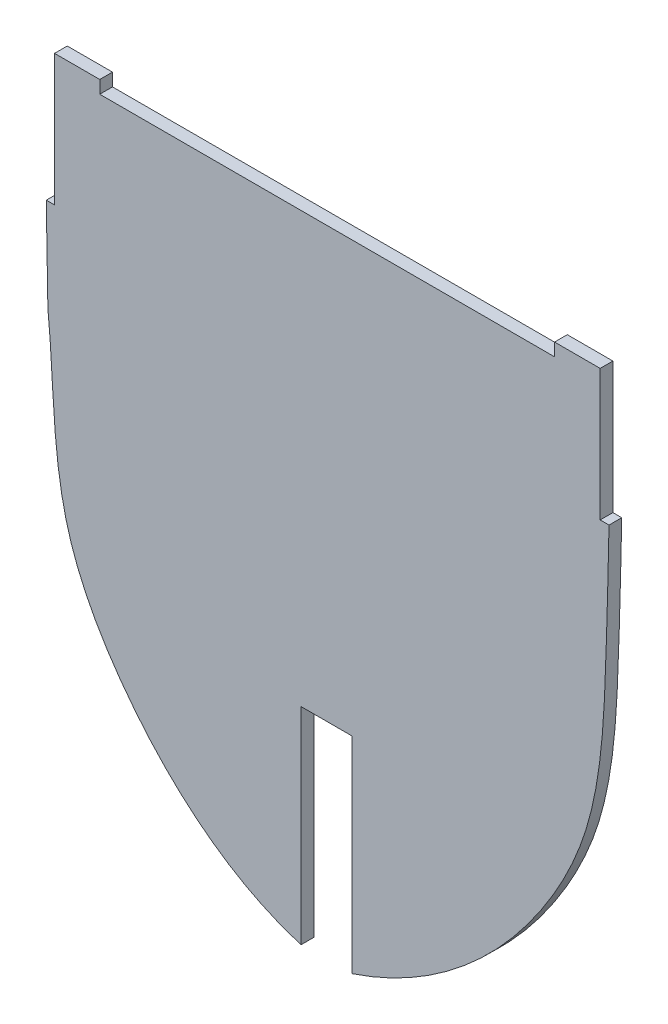
ISO-10303-21;
HEADER;
FILE_DESCRIPTION(('STEP AP214'),'2;1');
FILE_NAME('part.step','',(''),(''),'','','');
FILE_SCHEMA(('AUTOMOTIVE_DESIGN { 1 0 10303 214 1 1 1 1 }'));
ENDSEC;
DATA;
#1=APPLICATION_CONTEXT('core data for automotive mechanical design processes');
#2=APPLICATION_PROTOCOL_DEFINITION('international standard','automotive_design',2000,#1);
#3=PRODUCT_CONTEXT('',#1,'mechanical');
#4=PRODUCT('Part','Part','',(#3));
#5=PRODUCT_RELATED_PRODUCT_CATEGORY('part','',(#4));
#6=PRODUCT_DEFINITION_FORMATION('','',#4);
#7=PRODUCT_DEFINITION_CONTEXT('part definition',#1,'design');
#8=PRODUCT_DEFINITION('design','',#6,#7);
#9=PRODUCT_DEFINITION_SHAPE('','',#8);
#10=(LENGTH_UNIT() NAMED_UNIT(*) SI_UNIT(.MILLI.,.METRE.));
#11=(NAMED_UNIT(*) PLANE_ANGLE_UNIT() SI_UNIT($,.RADIAN.));
#12=(NAMED_UNIT(*) SI_UNIT($,.STERADIAN.) SOLID_ANGLE_UNIT());
#13=UNCERTAINTY_MEASURE_WITH_UNIT(LENGTH_MEASURE(1.E-05),#10,'distance_accuracy_value','');
#14=(GEOMETRIC_REPRESENTATION_CONTEXT(3) GLOBAL_UNCERTAINTY_ASSIGNED_CONTEXT((#13)) GLOBAL_UNIT_ASSIGNED_CONTEXT((#10,
#11,#12)) REPRESENTATION_CONTEXT('',''));
#15=CARTESIAN_POINT('',(0.,0.,0.));
#16=DIRECTION('',(0.,0.,1.));
#17=DIRECTION('',(1.,0.,0.));
#18=AXIS2_PLACEMENT_3D('',#15,#16,#17);
#19=CARTESIAN_POINT('',(213.16329184006,472.905120340673,2.));
#20=DIRECTION('',(1.,0.,0.));
#21=DIRECTION('',(0.,0.,-1.));
#22=AXIS2_PLACEMENT_3D('',#19,#20,#21);
#23=PLANE('',#22);
#24=DIRECTION('',(0.,-1.,0.));
#25=VECTOR('',#24,1.);
#26=CARTESIAN_POINT('',(213.16329184006,472.905120340673,0.));
#27=LINE('',#26,#25);
#28=CARTESIAN_POINT('',(213.16329184006,474.905120340673,0.));
#29=VERTEX_POINT('',#28);
#30=CARTESIAN_POINT('',(213.16329184006,442.577372397065,0.));
#31=VERTEX_POINT('',#30);
#32=EDGE_CURVE('E113',#29,#31,#27,.T.);
#33=ORIENTED_EDGE('',*,*,#32,.T.);
#34=DIRECTION('',(0.,0.,-1.));
#35=VECTOR('',#34,1.);
#36=CARTESIAN_POINT('',(213.16329184006,442.577372397065,2.));
#37=LINE('',#36,#35);
#38=CARTESIAN_POINT('',(213.16329184006,442.577372397065,2.));
#39=VERTEX_POINT('',#38);
#40=EDGE_CURVE('E11',#39,#31,#37,.T.);
#41=ORIENTED_EDGE('',*,*,#40,.F.);
#42=DIRECTION('',(0.,-1.,0.));
#43=VECTOR('',#42,1.);
#44=CARTESIAN_POINT('',(213.16329184006,474.905120340673,2.));
#45=LINE('',#44,#43);
#46=CARTESIAN_POINT('',(213.16329184006,474.905120340673,2.));
#47=VERTEX_POINT('',#46);
#48=EDGE_CURVE('E119',#47,#39,#45,.T.);
#49=ORIENTED_EDGE('',*,*,#48,.F.);
#50=DIRECTION('',(0.,0.,-1.));
#51=VECTOR('',#50,1.);
#52=CARTESIAN_POINT('',(213.16329184006,474.905120340673,2.));
#53=LINE('',#52,#51);
#54=EDGE_CURVE('E175',#47,#29,#53,.T.);
#55=ORIENTED_EDGE('',*,*,#54,.T.);
#56=EDGE_LOOP('',(#33,#41,#49,#55));
#57=FACE_BOUND('',#56,.T.);
#58=ADVANCED_FACE('F41',(#57),#23,.F.);
#59=CARTESIAN_POINT('',(213.16329184006,442.577372397065,2.));
#60=CARTESIAN_POINT('',(219.961627575748,444.823878535877,2.));
#61=CARTESIAN_POINT('',(231.612343059129,451.708919957433,2.));
#62=CARTESIAN_POINT('',(243.3317778018,465.610764176846,2.));
#63=CARTESIAN_POINT('',(252.103987955925,483.224638579665,2.));
#64=CARTESIAN_POINT('',(253.032140526392,502.963496163175,2.));
#65=CARTESIAN_POINT('',(253.388891197816,517.565791468852,2.));
#66=CARTESIAN_POINT('',(253.521985395969,523.784577737271,2.));
#67=B_SPLINE_CURVE_WITH_KNOTS('',3,(#59,#60,#61,#62,#63,#64,#65,#66),.UNSPECIFIED.,.F.,.F.,(4,1,
1,1,1,4),(0.,0.210843185516042,0.401843718085345,0.539496304342362,0.7964309356469,
0.983204581383894),.UNSPECIFIED.);
#68=DIRECTION('',(0.,0.,-1.));
#69=VECTOR('',#68,1.);
#70=SURFACE_OF_LINEAR_EXTRUSION('',#67,#69);
#71=CARTESIAN_POINT('',(213.16329184006,442.577372397065,0.));
#72=CARTESIAN_POINT('',(219.961627575748,444.823878535877,0.));
#73=CARTESIAN_POINT('',(231.612343059129,451.708919957433,0.));
#74=CARTESIAN_POINT('',(243.3317778018,465.610764176846,0.));
#75=CARTESIAN_POINT('',(252.103987955925,483.224638579665,0.));
#76=CARTESIAN_POINT('',(253.032140526392,502.963496163175,0.));
#77=CARTESIAN_POINT('',(253.388891197816,517.565791468852,0.));
#78=CARTESIAN_POINT('',(253.521985395969,523.784577737271,0.));
#79=B_SPLINE_CURVE_WITH_KNOTS('',3,(#71,#72,#73,#74,#75,#76,#77,#78),.UNSPECIFIED.,.F.,.F.,(4,1,
1,1,1,4),(0.,0.210843185516042,0.401843718085345,0.539496304342362,0.7964309356469,
0.983204581383894),.UNSPECIFIED.);
#80=CARTESIAN_POINT('',(253.521985395969,523.784577737271,0.));
#81=VERTEX_POINT('',#80);
#82=EDGE_CURVE('E183',#31,#81,#79,.T.);
#83=ORIENTED_EDGE('',*,*,#82,.T.);
#84=DIRECTION('',(0.,0.,-1.));
#85=VECTOR('',#84,1.);
#86=CARTESIAN_POINT('',(253.521985395969,523.784577737271,2.));
#87=LINE('',#86,#85);
#88=CARTESIAN_POINT('',(253.521985395969,523.784577737271,2.));
#89=VERTEX_POINT('',#88);
#90=EDGE_CURVE('E49',#89,#81,#87,.T.);
#91=ORIENTED_EDGE('',*,*,#90,.F.);
#92=EDGE_CURVE('E312',#39,#89,#67,.T.);
#93=ORIENTED_EDGE('',*,*,#92,.F.);
#94=ORIENTED_EDGE('',*,*,#40,.T.);
#95=EDGE_LOOP('',(#83,#91,#93,#94));
#96=FACE_BOUND('',#95,.T.);
#97=ADVANCED_FACE('F321',(#96),#70,.F.);
#98=CARTESIAN_POINT('',(252.132324540796,523.784577737271,2.));
#99=DIRECTION('',(0.,-1.,0.));
#100=DIRECTION('',(0.,0.,-1.));
#101=AXIS2_PLACEMENT_3D('',#98,#99,#100);
#102=PLANE('',#101);
#103=DIRECTION('',(-1.,0.,0.));
#104=VECTOR('',#103,1.);
#105=CARTESIAN_POINT('',(252.132324540796,523.784577737271,0.));
#106=LINE('',#105,#104);
#107=CARTESIAN_POINT('',(252.132324540796,523.784577737271,0.));
#108=VERTEX_POINT('',#107);
#109=EDGE_CURVE('E187',#81,#108,#106,.T.);
#110=ORIENTED_EDGE('',*,*,#109,.T.);
#111=DIRECTION('',(0.,0.,-1.));
#112=VECTOR('',#111,1.);
#113=CARTESIAN_POINT('',(252.132324540796,523.784577737271,2.));
#114=LINE('',#113,#112);
#115=CARTESIAN_POINT('',(252.132324540796,523.784577737271,2.));
#116=VERTEX_POINT('',#115);
#117=EDGE_CURVE('E252',#116,#108,#114,.T.);
#118=ORIENTED_EDGE('',*,*,#117,.F.);
#119=DIRECTION('',(-1.,0.,0.));
#120=VECTOR('',#119,1.);
#121=CARTESIAN_POINT('',(252.132324540796,523.784577737271,2.));
#122=LINE('',#121,#120);
#123=EDGE_CURVE('E261',#89,#116,#122,.T.);
#124=ORIENTED_EDGE('',*,*,#123,.F.);
#125=ORIENTED_EDGE('',*,*,#90,.T.);
#126=EDGE_LOOP('',(#110,#118,#124,#125));
#127=FACE_BOUND('',#126,.T.);
#128=ADVANCED_FACE('F259',(#127),#102,.F.);
#129=CARTESIAN_POINT('',(252.132324540796,544.404513770947,2.));
#130=DIRECTION('',(-1.,0.,0.));
#131=DIRECTION('',(0.,0.,1.));
#132=AXIS2_PLACEMENT_3D('',#129,#130,#131);
#133=PLANE('',#132);
#134=DIRECTION('',(0.,1.,0.));
#135=VECTOR('',#134,1.);
#136=CARTESIAN_POINT('',(252.132324540796,544.404513770947,0.));
#137=LINE('',#136,#135);
#138=CARTESIAN_POINT('',(252.132324540796,544.404513770947,0.));
#139=VERTEX_POINT('',#138);
#140=EDGE_CURVE('E192',#108,#139,#137,.T.);
#141=ORIENTED_EDGE('',*,*,#140,.T.);
#142=DIRECTION('',(0.,0.,-1.));
#143=VECTOR('',#142,1.);
#144=CARTESIAN_POINT('',(252.132324540796,544.404513770947,2.));
#145=LINE('',#144,#143);
#146=CARTESIAN_POINT('',(252.132324540796,544.404513770947,2.));
#147=VERTEX_POINT('',#146);
#148=EDGE_CURVE('E249',#147,#139,#145,.T.);
#149=ORIENTED_EDGE('',*,*,#148,.F.);
#150=DIRECTION('',(0.,1.,0.));
#151=VECTOR('',#150,1.);
#152=CARTESIAN_POINT('',(252.132324540796,544.404513770947,2.));
#153=LINE('',#152,#151);
#154=EDGE_CURVE('E279',#116,#147,#153,.T.);
#155=ORIENTED_EDGE('',*,*,#154,.F.);
#156=ORIENTED_EDGE('',*,*,#117,.T.);
#157=EDGE_LOOP('',(#141,#149,#155,#156));
#158=FACE_BOUND('',#157,.T.);
#159=ADVANCED_FACE('F270',(#158),#133,.F.);
#160=CARTESIAN_POINT('',(252.132324540796,544.404513770947,2.));
#161=DIRECTION('',(0.,-1.,0.));
#162=DIRECTION('',(0.,0.,-1.));
#163=AXIS2_PLACEMENT_3D('',#160,#161,#162);
#164=PLANE('',#163);
#165=DIRECTION('',(-1.,0.,0.));
#166=VECTOR('',#165,1.);
#167=CARTESIAN_POINT('',(252.132324540796,544.404513770947,0.));
#168=LINE('',#167,#166);
#169=CARTESIAN_POINT('',(244.967841267246,544.404513770947,0.));
#170=VERTEX_POINT('',#169);
#171=EDGE_CURVE('E194',#139,#170,#168,.T.);
#172=ORIENTED_EDGE('',*,*,#171,.T.);
#173=DIRECTION('',(0.,0.,-1.));
#174=VECTOR('',#173,1.);
#175=CARTESIAN_POINT('',(244.967841267246,544.404513770947,2.));
#176=LINE('',#175,#174);
#177=CARTESIAN_POINT('',(244.967841267246,544.404513770947,2.));
#178=VERTEX_POINT('',#177);
#179=EDGE_CURVE('E246',#178,#170,#176,.T.);
#180=ORIENTED_EDGE('',*,*,#179,.F.);
#181=DIRECTION('',(-1.,0.,0.));
#182=VECTOR('',#181,1.);
#183=CARTESIAN_POINT('',(252.132324540796,544.404513770947,2.));
#184=LINE('',#183,#182);
#185=EDGE_CURVE('E276',#147,#178,#184,.T.);
#186=ORIENTED_EDGE('',*,*,#185,.F.);
#187=ORIENTED_EDGE('',*,*,#148,.T.);
#188=EDGE_LOOP('',(#172,#180,#186,#187));
#189=FACE_BOUND('',#188,.T.);
#190=ADVANCED_FACE('F274',(#189),#164,.F.);
#191=CARTESIAN_POINT('',(244.967841267246,544.404513770947,2.));
#192=DIRECTION('',(1.,0.,0.));
#193=DIRECTION('',(0.,0.,-1.));
#194=AXIS2_PLACEMENT_3D('',#191,#192,#193);
#195=PLANE('',#194);
#196=DIRECTION('',(0.,-1.,0.));
#197=VECTOR('',#196,1.);
#198=CARTESIAN_POINT('',(244.967841267246,544.404513770947,0.));
#199=LINE('',#198,#197);
#200=CARTESIAN_POINT('',(244.967841267246,542.393386476158,0.));
#201=VERTEX_POINT('',#200);
#202=EDGE_CURVE('E196',#170,#201,#199,.T.);
#203=ORIENTED_EDGE('',*,*,#202,.T.);
#204=DIRECTION('',(0.,0.,-1.));
#205=VECTOR('',#204,1.);
#206=CARTESIAN_POINT('',(244.967841267246,542.393386476158,2.));
#207=LINE('',#206,#205);
#208=CARTESIAN_POINT('',(244.967841267246,542.393386476158,2.));
#209=VERTEX_POINT('',#208);
#210=EDGE_CURVE('E243',#209,#201,#207,.T.);
#211=ORIENTED_EDGE('',*,*,#210,.F.);
#212=DIRECTION('',(0.,-1.,0.));
#213=VECTOR('',#212,1.);
#214=CARTESIAN_POINT('',(244.967841267246,544.404513770947,2.));
#215=LINE('',#214,#213);
#216=EDGE_CURVE('E278',#178,#209,#215,.T.);
#217=ORIENTED_EDGE('',*,*,#216,.F.);
#218=ORIENTED_EDGE('',*,*,#179,.T.);
#219=EDGE_LOOP('',(#203,#211,#217,#218));
#220=FACE_BOUND('',#219,.T.);
#221=ADVANCED_FACE('F330',(#220),#195,.F.);
#222=CARTESIAN_POINT('',(244.967841267246,542.393386476158,2.));
#223=DIRECTION('',(0.,-1.,0.));
#224=DIRECTION('',(0.,0.,-1.));
#225=AXIS2_PLACEMENT_3D('',#222,#223,#224);
#226=PLANE('',#225);
#227=DIRECTION('',(-1.,0.,0.));
#228=VECTOR('',#227,1.);
#229=CARTESIAN_POINT('',(244.967841267246,542.393386476158,0.));
#230=LINE('',#229,#228);
#231=CARTESIAN_POINT('',(173.531139846847,542.393386476158,0.));
#232=VERTEX_POINT('',#231);
#233=EDGE_CURVE('E198',#201,#232,#230,.T.);
#234=ORIENTED_EDGE('',*,*,#233,.T.);
#235=DIRECTION('',(0.,0.,-1.));
#236=VECTOR('',#235,1.);
#237=CARTESIAN_POINT('',(173.531139846847,542.393386476158,2.));
#238=LINE('',#237,#236);
#239=CARTESIAN_POINT('',(173.531139846847,542.393386476158,2.));
#240=VERTEX_POINT('',#239);
#241=EDGE_CURVE('E240',#240,#232,#238,.T.);
#242=ORIENTED_EDGE('',*,*,#241,.F.);
#243=DIRECTION('',(-1.,0.,0.));
#244=VECTOR('',#243,1.);
#245=CARTESIAN_POINT('',(244.967841267246,542.393386476158,2.));
#246=LINE('',#245,#244);
#247=EDGE_CURVE('E281',#209,#240,#246,.T.);
#248=ORIENTED_EDGE('',*,*,#247,.F.);
#249=ORIENTED_EDGE('',*,*,#210,.T.);
#250=EDGE_LOOP('',(#234,#242,#248,#249));
#251=FACE_BOUND('',#250,.T.);
#252=ADVANCED_FACE('F333',(#251),#226,.F.);
#253=CARTESIAN_POINT('',(173.531139846847,542.393386476158,2.));
#254=DIRECTION('',(-1.,0.,0.));
#255=DIRECTION('',(0.,0.,1.));
#256=AXIS2_PLACEMENT_3D('',#253,#254,#255);
#257=PLANE('',#256);
#258=DIRECTION('',(0.,1.,0.));
#259=VECTOR('',#258,1.);
#260=CARTESIAN_POINT('',(173.531139846847,542.393386476158,0.));
#261=LINE('',#260,#259);
#262=CARTESIAN_POINT('',(173.531139846847,544.404513770947,0.));
#263=VERTEX_POINT('',#262);
#264=EDGE_CURVE('E200',#232,#263,#261,.T.);
#265=ORIENTED_EDGE('',*,*,#264,.T.);
#266=DIRECTION('',(0.,0.,-1.));
#267=VECTOR('',#266,1.);
#268=CARTESIAN_POINT('',(173.531139846847,544.404513770947,2.));
#269=LINE('',#268,#267);
#270=CARTESIAN_POINT('',(173.531139846847,544.404513770947,2.));
#271=VERTEX_POINT('',#270);
#272=EDGE_CURVE('E237',#271,#263,#269,.T.);
#273=ORIENTED_EDGE('',*,*,#272,.F.);
#274=DIRECTION('',(0.,1.,0.));
#275=VECTOR('',#274,1.);
#276=CARTESIAN_POINT('',(173.531139846847,542.393386476158,2.));
#277=LINE('',#276,#275);
#278=EDGE_CURVE('E287',#240,#271,#277,.T.);
#279=ORIENTED_EDGE('',*,*,#278,.F.);
#280=ORIENTED_EDGE('',*,*,#241,.T.);
#281=EDGE_LOOP('',(#265,#273,#279,#280));
#282=FACE_BOUND('',#281,.T.);
#283=ADVANCED_FACE('F337',(#282),#257,.F.);
#284=CARTESIAN_POINT('',(173.531139846847,544.404513770947,2.));
#285=DIRECTION('',(0.,-1.,0.));
#286=DIRECTION('',(0.,0.,-1.));
#287=AXIS2_PLACEMENT_3D('',#284,#285,#286);
#288=PLANE('',#287);
#289=DIRECTION('',(-1.,0.,0.));
#290=VECTOR('',#289,1.);
#291=CARTESIAN_POINT('',(173.531139846847,544.404513770947,0.));
#292=LINE('',#291,#290);
#293=CARTESIAN_POINT('',(166.427186265172,544.404513770947,0.));
#294=VERTEX_POINT('',#293);
#295=EDGE_CURVE('E202',#263,#294,#292,.T.);
#296=ORIENTED_EDGE('',*,*,#295,.T.);
#297=DIRECTION('',(0.,0.,-1.));
#298=VECTOR('',#297,1.);
#299=CARTESIAN_POINT('',(166.427186265172,544.404513770947,2.));
#300=LINE('',#299,#298);
#301=CARTESIAN_POINT('',(166.427186265172,544.404513770947,2.));
#302=VERTEX_POINT('',#301);
#303=EDGE_CURVE('E234',#302,#294,#300,.T.);
#304=ORIENTED_EDGE('',*,*,#303,.F.);
#305=DIRECTION('',(-1.,0.,0.));
#306=VECTOR('',#305,1.);
#307=CARTESIAN_POINT('',(173.531139846847,544.404513770947,2.));
#308=LINE('',#307,#306);
#309=EDGE_CURVE('E289',#271,#302,#308,.T.);
#310=ORIENTED_EDGE('',*,*,#309,.F.);
#311=ORIENTED_EDGE('',*,*,#272,.T.);
#312=EDGE_LOOP('',(#296,#304,#310,#311));
#313=FACE_BOUND('',#312,.T.);
#314=ADVANCED_FACE('F341',(#313),#288,.F.);
#315=CARTESIAN_POINT('',(166.427186265172,544.404513770947,2.));
#316=DIRECTION('',(1.,0.,0.));
#317=DIRECTION('',(0.,0.,-1.));
#318=AXIS2_PLACEMENT_3D('',#315,#316,#317);
#319=PLANE('',#318);
#320=DIRECTION('',(0.,-1.,0.));
#321=VECTOR('',#320,1.);
#322=CARTESIAN_POINT('',(166.427186265172,544.404513770947,0.));
#323=LINE('',#322,#321);
#324=CARTESIAN_POINT('',(166.427186265172,523.784577737271,0.));
#325=VERTEX_POINT('',#324);
#326=EDGE_CURVE('E204',#294,#325,#323,.T.);
#327=ORIENTED_EDGE('',*,*,#326,.T.);
#328=DIRECTION('',(0.,0.,-1.));
#329=VECTOR('',#328,1.);
#330=CARTESIAN_POINT('',(166.427186265172,523.784577737271,2.));
#331=LINE('',#330,#329);
#332=CARTESIAN_POINT('',(166.427186265172,523.784577737271,2.));
#333=VERTEX_POINT('',#332);
#334=EDGE_CURVE('E231',#333,#325,#331,.T.);
#335=ORIENTED_EDGE('',*,*,#334,.F.);
#336=DIRECTION('',(0.,-1.,0.));
#337=VECTOR('',#336,1.);
#338=CARTESIAN_POINT('',(166.427186265172,544.404513770947,2.));
#339=LINE('',#338,#337);
#340=EDGE_CURVE('E291',#302,#333,#339,.T.);
#341=ORIENTED_EDGE('',*,*,#340,.F.);
#342=ORIENTED_EDGE('',*,*,#303,.T.);
#343=EDGE_LOOP('',(#327,#335,#341,#342));
#344=FACE_BOUND('',#343,.T.);
#345=ADVANCED_FACE('F345',(#344),#319,.F.);
#346=CARTESIAN_POINT('',(166.427186265172,523.784577737271,2.));
#347=DIRECTION('',(0.,-1.,0.));
#348=DIRECTION('',(0.,0.,-1.));
#349=AXIS2_PLACEMENT_3D('',#346,#347,#348);
#350=PLANE('',#349);
#351=DIRECTION('',(-1.,0.,0.));
#352=VECTOR('',#351,1.);
#353=CARTESIAN_POINT('',(166.427186265172,523.784577737271,0.));
#354=LINE('',#353,#352);
#355=CARTESIAN_POINT('',(165.125301121243,523.784577737271,0.));
#356=VERTEX_POINT('',#355);
#357=EDGE_CURVE('E206',#325,#356,#354,.T.);
#358=ORIENTED_EDGE('',*,*,#357,.T.);
#359=DIRECTION('',(0.,0.,-1.));
#360=VECTOR('',#359,1.);
#361=CARTESIAN_POINT('',(165.125301121243,523.784577737271,2.));
#362=LINE('',#361,#360);
#363=CARTESIAN_POINT('',(165.125301121243,523.784577737271,2.));
#364=VERTEX_POINT('',#363);
#365=EDGE_CURVE('E228',#364,#356,#362,.T.);
#366=ORIENTED_EDGE('',*,*,#365,.F.);
#367=DIRECTION('',(-1.,0.,0.));
#368=VECTOR('',#367,1.);
#369=CARTESIAN_POINT('',(166.427186265172,523.784577737271,2.));
#370=LINE('',#369,#368);
#371=EDGE_CURVE('E293',#333,#364,#370,.T.);
#372=ORIENTED_EDGE('',*,*,#371,.F.);
#373=ORIENTED_EDGE('',*,*,#334,.T.);
#374=EDGE_LOOP('',(#358,#366,#372,#373));
#375=FACE_BOUND('',#374,.T.);
#376=ADVANCED_FACE('F304',(#375),#350,.F.);
#377=CARTESIAN_POINT('',(165.125301121243,523.784577737271,2.));
#378=DIRECTION('',(0.999846528768927,0.0175191012533924,0.));
#379=DIRECTION('',(-0.0175191012533924,0.999846528768927,0.));
#380=AXIS2_PLACEMENT_3D('',#377,#378,#379);
#381=PLANE('',#380);
#382=CARTESIAN_POINT('',(165.125301121243,523.784577737271,0.));
#383=CARTESIAN_POINT('',(165.381520734889,509.161664860562,0.));
#384=B_SPLINE_CURVE_WITH_KNOTS('',1,(#382,#383),.UNSPECIFIED.,.F.,.F.,(2,2),(0.,1.),.UNSPECIFIED.);
#385=CARTESIAN_POINT('',(165.381520734889,509.161664860562,0.));
#386=VERTEX_POINT('',#385);
#387=EDGE_CURVE('E208',#356,#386,#384,.T.);
#388=ORIENTED_EDGE('',*,*,#387,.T.);
#389=DIRECTION('',(0.,0.,-1.));
#390=VECTOR('',#389,1.);
#391=CARTESIAN_POINT('',(165.381520734889,509.161664860562,2.));
#392=LINE('',#391,#390);
#393=CARTESIAN_POINT('',(165.381520734889,509.161664860562,2.));
#394=VERTEX_POINT('',#393);
#395=EDGE_CURVE('E170',#394,#386,#392,.T.);
#396=ORIENTED_EDGE('',*,*,#395,.F.);
#397=CARTESIAN_POINT('',(165.125301121243,523.784577737271,2.));
#398=CARTESIAN_POINT('',(165.381520734889,509.161664860562,2.));
#399=B_SPLINE_CURVE_WITH_KNOTS('',1,(#397,#398),.UNSPECIFIED.,.F.,.F.,(2,2),(0.,1.),.UNSPECIFIED.);
#400=EDGE_CURVE('E160',#364,#394,#399,.T.);
#401=ORIENTED_EDGE('',*,*,#400,.F.);
#402=ORIENTED_EDGE('',*,*,#365,.T.);
#403=EDGE_LOOP('',(#388,#396,#401,#402));
#404=FACE_BOUND('',#403,.T.);
#405=ADVANCED_FACE('F308',(#404),#381,.F.);
#406=CARTESIAN_POINT('',(165.381520734889,509.161664860562,2.));
#407=CARTESIAN_POINT('',(166.39849219563,499.581380375014,2.));
#408=CARTESIAN_POINT('',(165.660716298866,482.596552628012,2.));
#409=CARTESIAN_POINT('',(178.575212939985,459.918617670611,2.));
#410=CARTESIAN_POINT('',(192.311763968553,447.256935323015,2.));
#411=CARTESIAN_POINT('',(203.145863384914,443.111286653283,2.));
#412=CARTESIAN_POINT('',(205.161029469922,442.514323355504,2.));
#413=B_SPLINE_CURVE_WITH_KNOTS('',3,(#406,#407,#408,#409,#410,#411,#412),.UNSPECIFIED.,.F.,.F.,
(4,1,1,1,4),(0.,0.348658777369942,0.570107959428208,0.906139099435763,0.980139944950654),.UNSPECIFIED.);
#414=DIRECTION('',(0.,0.,-1.));
#415=VECTOR('',#414,1.);
#416=SURFACE_OF_LINEAR_EXTRUSION('',#413,#415);
#417=CARTESIAN_POINT('',(165.381520734889,509.161664860562,0.));
#418=CARTESIAN_POINT('',(166.39849219563,499.581380375014,0.));
#419=CARTESIAN_POINT('',(165.660716298866,482.596552628012,0.));
#420=CARTESIAN_POINT('',(178.575212939985,459.918617670611,0.));
#421=CARTESIAN_POINT('',(192.311763968553,447.256935323015,0.));
#422=CARTESIAN_POINT('',(203.145863384914,443.111286653283,0.));
#423=CARTESIAN_POINT('',(205.161029469922,442.514323355504,0.));
#424=B_SPLINE_CURVE_WITH_KNOTS('',3,(#417,#418,#419,#420,#421,#422,#423),.UNSPECIFIED.,.F.,.F.,
(4,1,1,1,4),(0.,0.348658777369942,0.570107959428208,0.906139099435763,0.980139944950654),.UNSPECIFIED.);
#425=CARTESIAN_POINT('',(205.161029469922,442.514323355504,0.));
#426=VERTEX_POINT('',#425);
#427=EDGE_CURVE('E169',#386,#426,#424,.T.);
#428=ORIENTED_EDGE('',*,*,#427,.T.);
#429=DIRECTION('',(0.,0.,-1.));
#430=VECTOR('',#429,1.);
#431=CARTESIAN_POINT('',(205.161029469922,442.514323355504,2.));
#432=LINE('',#431,#430);
#433=CARTESIAN_POINT('',(205.161029469922,442.514323355504,2.));
#434=VERTEX_POINT('',#433);
#435=EDGE_CURVE('E166',#434,#426,#432,.T.);
#436=ORIENTED_EDGE('',*,*,#435,.F.);
#437=EDGE_CURVE('E154',#394,#434,#413,.T.);
#438=ORIENTED_EDGE('',*,*,#437,.F.);
#439=ORIENTED_EDGE('',*,*,#395,.T.);
#440=EDGE_LOOP('',(#428,#436,#438,#439));
#441=FACE_BOUND('',#440,.T.);
#442=ADVANCED_FACE('F167',(#441),#416,.F.);
#443=CARTESIAN_POINT('',(205.161029469922,472.905120340673,2.));
#444=DIRECTION('',(-1.,0.,0.));
#445=DIRECTION('',(0.,0.,1.));
#446=AXIS2_PLACEMENT_3D('',#443,#444,#445);
#447=PLANE('',#446);
#448=DIRECTION('',(0.,1.,0.));
#449=VECTOR('',#448,1.);
#450=CARTESIAN_POINT('',(205.161029469922,472.905120340673,0.));
#451=LINE('',#450,#449);
#452=CARTESIAN_POINT('',(205.161029469922,474.905120340673,0.));
#453=VERTEX_POINT('',#452);
#454=EDGE_CURVE('E106',#426,#453,#451,.T.);
#455=ORIENTED_EDGE('',*,*,#454,.T.);
#456=DIRECTION('',(0.,0.,-1.));
#457=VECTOR('',#456,1.);
#458=CARTESIAN_POINT('',(205.161029469922,474.905120340673,2.));
#459=LINE('',#458,#457);
#460=CARTESIAN_POINT('',(205.161029469922,474.905120340673,2.));
#461=VERTEX_POINT('',#460);
#462=EDGE_CURVE('E171',#461,#453,#459,.T.);
#463=ORIENTED_EDGE('',*,*,#462,.F.);
#464=DIRECTION('',(0.,1.,0.));
#465=VECTOR('',#464,1.);
#466=CARTESIAN_POINT('',(205.161029469922,472.905120340673,2.));
#467=LINE('',#466,#465);
#468=EDGE_CURVE('E158',#434,#461,#467,.T.);
#469=ORIENTED_EDGE('',*,*,#468,.F.);
#470=ORIENTED_EDGE('',*,*,#435,.T.);
#471=EDGE_LOOP('',(#455,#463,#469,#470));
#472=FACE_BOUND('',#471,.T.);
#473=ADVANCED_FACE('F173',(#472),#447,.F.);
#474=CARTESIAN_POINT('',(205.161029469922,474.905120340673,2.));
#475=DIRECTION('',(0.,1.,0.));
#476=DIRECTION('',(0.,0.,1.));
#477=AXIS2_PLACEMENT_3D('',#474,#475,#476);
#478=PLANE('',#477);
#479=DIRECTION('',(1.,0.,0.));
#480=VECTOR('',#479,1.);
#481=CARTESIAN_POINT('',(205.161029469922,474.905120340673,0.));
#482=LINE('',#481,#480);
#483=EDGE_CURVE('E222',#453,#29,#482,.T.);
#484=ORIENTED_EDGE('',*,*,#483,.T.);
#485=ORIENTED_EDGE('',*,*,#54,.F.);
#486=DIRECTION('',(1.,0.,0.));
#487=VECTOR('',#486,1.);
#488=CARTESIAN_POINT('',(205.161029469922,474.905120340673,2.));
#489=LINE('',#488,#487);
#490=EDGE_CURVE('E57',#461,#47,#489,.T.);
#491=ORIENTED_EDGE('',*,*,#490,.F.);
#492=ORIENTED_EDGE('',*,*,#462,.T.);
#493=EDGE_LOOP('',(#484,#485,#491,#492));
#494=FACE_BOUND('',#493,.T.);
#495=ADVANCED_FACE('F310',(#494),#478,.F.);
#496=CARTESIAN_POINT('',(247.970177624726,475.376994830623,2.));
#497=DIRECTION('',(0.,0.,1.));
#498=DIRECTION('',(1.,0.,0.));
#499=AXIS2_PLACEMENT_3D('',#496,#497,#498);
#500=PLANE('',#499);
#501=ORIENTED_EDGE('',*,*,#48,.T.);
#502=ORIENTED_EDGE('',*,*,#92,.T.);
#503=ORIENTED_EDGE('',*,*,#123,.T.);
#504=ORIENTED_EDGE('',*,*,#154,.T.);
#505=ORIENTED_EDGE('',*,*,#185,.T.);
#506=ORIENTED_EDGE('',*,*,#216,.T.);
#507=ORIENTED_EDGE('',*,*,#247,.T.);
#508=ORIENTED_EDGE('',*,*,#278,.T.);
#509=ORIENTED_EDGE('',*,*,#309,.T.);
#510=ORIENTED_EDGE('',*,*,#340,.T.);
#511=ORIENTED_EDGE('',*,*,#371,.T.);
#512=ORIENTED_EDGE('',*,*,#400,.T.);
#513=ORIENTED_EDGE('',*,*,#437,.T.);
#514=ORIENTED_EDGE('',*,*,#468,.T.);
#515=ORIENTED_EDGE('',*,*,#490,.T.);
#516=EDGE_LOOP('',(#501,#502,#503,#504,#505,#506,#507,#508,#509,#510,#511,#512,#513,#514,#515));
#517=FACE_BOUND('',#516,.T.);
#518=ADVANCED_FACE('F156',(#517),#500,.T.);
#519=CARTESIAN_POINT('',(247.970177624726,475.376994830623,0.));
#520=DIRECTION('',(0.,0.,1.));
#521=DIRECTION('',(1.,0.,0.));
#522=AXIS2_PLACEMENT_3D('',#519,#520,#521);
#523=PLANE('',#522);
#524=ORIENTED_EDGE('',*,*,#32,.F.);
#525=ORIENTED_EDGE('',*,*,#483,.F.);
#526=ORIENTED_EDGE('',*,*,#454,.F.);
#527=ORIENTED_EDGE('',*,*,#427,.F.);
#528=ORIENTED_EDGE('',*,*,#387,.F.);
#529=ORIENTED_EDGE('',*,*,#357,.F.);
#530=ORIENTED_EDGE('',*,*,#326,.F.);
#531=ORIENTED_EDGE('',*,*,#295,.F.);
#532=ORIENTED_EDGE('',*,*,#264,.F.);
#533=ORIENTED_EDGE('',*,*,#233,.F.);
#534=ORIENTED_EDGE('',*,*,#202,.F.);
#535=ORIENTED_EDGE('',*,*,#171,.F.);
#536=ORIENTED_EDGE('',*,*,#140,.F.);
#537=ORIENTED_EDGE('',*,*,#109,.F.);
#538=ORIENTED_EDGE('',*,*,#82,.F.);
#539=EDGE_LOOP('',(#524,#525,#526,#527,#528,#529,#530,#531,#532,#533,#534,#535,#536,#537,#538));
#540=FACE_BOUND('',#539,.T.);
#541=ADVANCED_FACE('F265',(#540),#523,.F.);
#542=CLOSED_SHELL('',(#58,#97,#128,#159,#190,#221,#252,#283,#314,#345,#376,#405,#442,#473,#495,
#518,#541));
#543=MANIFOLD_SOLID_BREP('B2',#542);
#544=ADVANCED_BREP_SHAPE_REPRESENTATION('',(#18,#543),#14);
#545=SHAPE_DEFINITION_REPRESENTATION(#9,#544);
ENDSEC;
END-ISO-10303-21;
